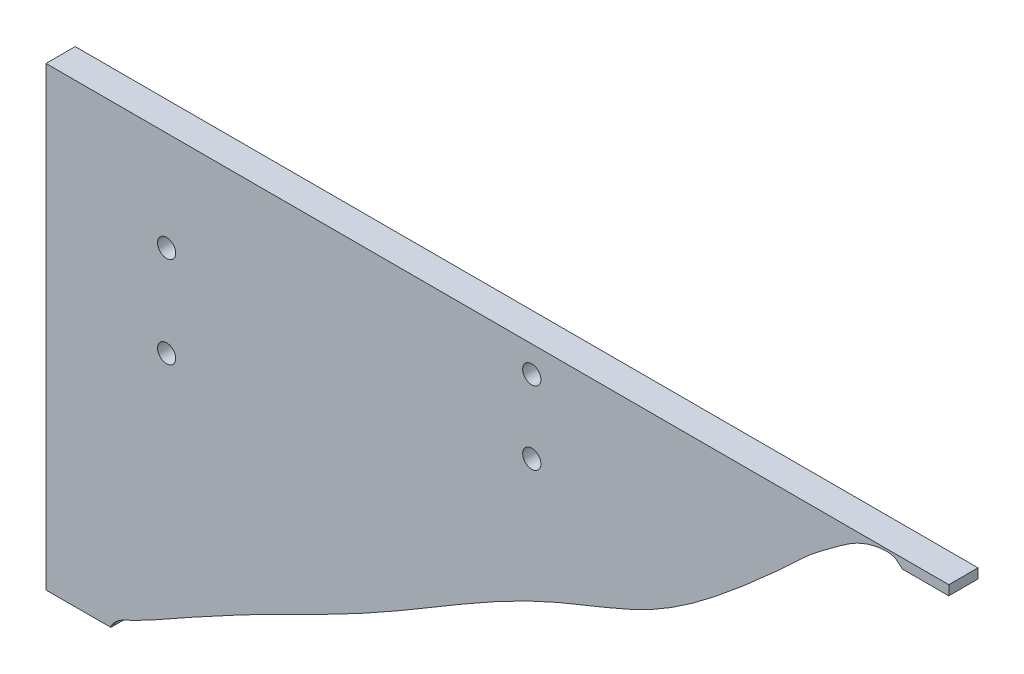
ISO-10303-21;
HEADER;
FILE_DESCRIPTION(('STEP AP214'),'2;1');
FILE_NAME('part.step','',(''),(''),'','','');
FILE_SCHEMA(('AUTOMOTIVE_DESIGN { 1 0 10303 214 1 1 1 1 }'));
ENDSEC;
DATA;
#1=APPLICATION_CONTEXT('core data for automotive mechanical design processes');
#2=APPLICATION_PROTOCOL_DEFINITION('international standard','automotive_design',2000,#1);
#3=PRODUCT_CONTEXT('',#1,'mechanical');
#4=PRODUCT('Part','Part','',(#3));
#5=PRODUCT_RELATED_PRODUCT_CATEGORY('part','',(#4));
#6=PRODUCT_DEFINITION_FORMATION('','',#4);
#7=PRODUCT_DEFINITION_CONTEXT('part definition',#1,'design');
#8=PRODUCT_DEFINITION('design','',#6,#7);
#9=PRODUCT_DEFINITION_SHAPE('','',#8);
#10=(LENGTH_UNIT() NAMED_UNIT(*) SI_UNIT(.MILLI.,.METRE.));
#11=(NAMED_UNIT(*) PLANE_ANGLE_UNIT() SI_UNIT($,.RADIAN.));
#12=(NAMED_UNIT(*) SI_UNIT($,.STERADIAN.) SOLID_ANGLE_UNIT());
#13=UNCERTAINTY_MEASURE_WITH_UNIT(LENGTH_MEASURE(1.E-05),#10,'distance_accuracy_value','');
#14=(GEOMETRIC_REPRESENTATION_CONTEXT(3) GLOBAL_UNCERTAINTY_ASSIGNED_CONTEXT((#13)) GLOBAL_UNIT_ASSIGNED_CONTEXT((#10,
#11,#12)) REPRESENTATION_CONTEXT('',''));
#15=CARTESIAN_POINT('',(0.,0.,0.));
#16=DIRECTION('',(0.,0.,1.));
#17=DIRECTION('',(1.,0.,0.));
#18=AXIS2_PLACEMENT_3D('',#15,#16,#17);
#19=CARTESIAN_POINT('',(-124.169636204117,-122.711595078371,99.9999999999997));
#20=DIRECTION('',(0.,0.,-1.));
#21=DIRECTION('',(-1.,0.,0.));
#22=AXIS2_PLACEMENT_3D('',#19,#20,#21);
#23=PLANE('',#22);
#24=CARTESIAN_POINT('',(-100.,-50.,99.9999999999997));
#25=DIRECTION('',(0.,0.,-1.));
#26=DIRECTION('',(-1.,0.,0.));
#27=AXIS2_PLACEMENT_3D('',#24,#25,#26);
#28=CIRCLE('',#27,2.5);
#29=CARTESIAN_POINT('',(-102.5,-50.,99.9999999999997));
#30=VERTEX_POINT('',#29);
#31=EDGE_CURVE('E199',#30,#30,#28,.F.);
#32=ORIENTED_EDGE('',*,*,#31,.F.);
#33=EDGE_LOOP('',(#32));
#34=FACE_BOUND('',#33,.T.);
#35=CARTESIAN_POINT('',(0.0705666698621599,-4.96037406111782,99.9999999999997));
#36=DIRECTION('',(0.,0.,-1.));
#37=DIRECTION('',(-1.,0.,0.));
#38=AXIS2_PLACEMENT_3D('',#35,#36,#37);
#39=CIRCLE('',#38,2.5);
#40=CARTESIAN_POINT('',(-2.42943333013784,-4.96037406111782,99.9999999999997));
#41=VERTEX_POINT('',#40);
#42=EDGE_CURVE('E187',#41,#41,#39,.F.);
#43=ORIENTED_EDGE('',*,*,#42,.F.);
#44=EDGE_LOOP('',(#43));
#45=FACE_BOUND('',#44,.T.);
#46=CARTESIAN_POINT('',(-115.279814759587,-122.698196579646,99.9999999999997));
#47=CARTESIAN_POINT('',(-121.20636212454,-122.707302344875,99.9999999999997));
#48=CARTESIAN_POINT('',(-127.132910077342,-122.716026331975,99.9999999999997));
#49=CARTESIAN_POINT('',(-133.059458267704,-122.724578016771,99.9999999999997));
#50=B_SPLINE_CURVE_WITH_KNOTS('',3,(#46,#47,#48,#49),.UNSPECIFIED.,.F.,.F.,(4,4),(0.,1.),.UNSPECIFIED.);
#51=CARTESIAN_POINT('',(-133.059458267704,-122.724578016771,99.9999999999997));
#52=VERTEX_POINT('',#51);
#53=CARTESIAN_POINT('',(-115.279814759587,-122.698196579646,99.9999999999997));
#54=VERTEX_POINT('',#53);
#55=EDGE_CURVE('E242',#52,#54,#50,.F.);
#56=ORIENTED_EDGE('',*,*,#55,.T.);
#57=CARTESIAN_POINT('',(101.542697698655,-0.397367776712153,99.9999999999997));
#58=CARTESIAN_POINT('',(101.469163101263,-0.247017982916062,99.9999999999997));
#59=CARTESIAN_POINT('',(101.356910621738,-0.124020229300448,99.9999999999997));
#60=CARTESIAN_POINT('',(101.109220352085,0.0978628181401973,99.9999999999997));
#61=CARTESIAN_POINT('',(100.977881083221,0.199766638114996,99.9999999999997));
#62=CARTESIAN_POINT('',(100.718358444522,0.407380198846738,99.9999999999997));
#63=CARTESIAN_POINT('',(100.590791378732,0.5140176030452,99.9999999999997));
#64=CARTESIAN_POINT('',(100.331252477116,0.720990659515745,99.9999999999997));
#65=CARTESIAN_POINT('',(100.199295601272,0.82112105301081,99.9999999999997));
#66=CARTESIAN_POINT('',(99.9282615121084,1.01045720873266,99.9999999999997));
#67=CARTESIAN_POINT('',(99.7891548310066,1.09961775896339,99.9999999999997));
#68=CARTESIAN_POINT('',(99.4961529886652,1.25524910727041,99.9999999999997));
#69=CARTESIAN_POINT('',(99.3412082182809,1.32251509346093,99.9999999999997));
#70=CARTESIAN_POINT('',(98.8702388773052,1.48720168883613,99.9999999999997));
#71=CARTESIAN_POINT('',(98.5459693345183,1.55130716658925,99.9999999999997));
#72=CARTESIAN_POINT('',(97.8863590845331,1.63036423385321,99.9999999999997));
#73=CARTESIAN_POINT('',(97.5528034752308,1.64511922098397,99.9999999999997));
#74=CARTESIAN_POINT('',(96.891170940384,1.64749112226704,99.9999999999997));
#75=CARTESIAN_POINT('',(96.5612171783758,1.6322043359926,99.9999999999997));
#76=CARTESIAN_POINT('',(95.5733868144175,1.54755599472912,99.9999999999997));
#77=CARTESIAN_POINT('',(94.9153123779226,1.4450567700185,99.9999999999997));
#78=CARTESIAN_POINT('',(93.616722452856,1.1797323774055,99.9999999999997));
#79=CARTESIAN_POINT('',(92.9751727490288,1.01437558630133,99.9999999999997));
#80=CARTESIAN_POINT('',(91.7066276289974,0.622224865003363,99.9999999999997));
#81=CARTESIAN_POINT('',(91.0864370534127,0.396457422235448,99.9999999999997));
#82=CARTESIAN_POINT('',(89.2765755309225,-0.369913249696398,99.9999999999997));
#83=CARTESIAN_POINT('',(88.1378362029038,-1.00679362295404,99.9999999999997));
#84=CARTESIAN_POINT('',(85.9306948164455,-2.41116752617038,99.9999999999997));
#85=CARTESIAN_POINT('',(84.8607996750002,-3.17763339066288,99.9999999999997));
#86=CARTESIAN_POINT('',(82.7348828085725,-4.72485917787858,99.9999999999997));
#87=CARTESIAN_POINT('',(81.6766557694189,-5.50485203568875,99.9999999999997));
#88=CARTESIAN_POINT('',(79.5670549194846,-7.07407886526673,99.9999999999997));
#89=CARTESIAN_POINT('',(78.5147692119556,-7.8634836119559,99.9999999999997));
#90=CARTESIAN_POINT('',(76.9732571366074,-9.09224101027398,99.9999999999997));
#91=CARTESIAN_POINT('',(76.4662794594427,-9.50971502516881,99.9999999999997));
#92=CARTESIAN_POINT('',(75.4718021148715,-10.3670615792103,99.9999999999997));
#93=CARTESIAN_POINT('',(74.9853438012207,-10.8081316117172,99.9999999999997));
#94=CARTESIAN_POINT('',(73.5461137023219,-12.1545070499932,99.9999999999997));
#95=CARTESIAN_POINT('',(72.609063716763,-13.0775021698299,99.9999999999997));
#96=CARTESIAN_POINT('',(70.6992248441633,-14.8839826795536,99.9999999999997));
#97=CARTESIAN_POINT('',(69.7306505425582,-15.7724493099651,99.9999999999997));
#98=CARTESIAN_POINT('',(66.8182305427634,-18.4306034053667,99.9999999999997));
#99=CARTESIAN_POINT('',(64.873127244851,-20.1996797886697,99.9999999999997));
#100=CARTESIAN_POINT('',(60.9392904269927,-23.6863594082087,99.9999999999997));
#101=CARTESIAN_POINT('',(58.95505223961,-25.4088617700271,99.9999999999997));
#102=CARTESIAN_POINT('',(54.9464865685715,-28.8056350092525,99.9999999999997));
#103=CARTESIAN_POINT('',(52.921196036184,-30.4787472414797,99.9999999999997));
#104=CARTESIAN_POINT('',(49.8395566560479,-32.9358357540928,99.9999999999997));
#105=CARTESIAN_POINT('',(48.8050140745123,-33.7460471816799,99.9999999999997));
#106=CARTESIAN_POINT('',(46.7175744939729,-35.3443878133609,99.9999999999997));
#107=CARTESIAN_POINT('',(45.6640343770027,-36.1330314593292,99.9999999999997));
#108=CARTESIAN_POINT('',(42.4762593951903,-38.4497740668082,99.9999999999997));
#109=CARTESIAN_POINT('',(40.3111603475952,-39.9263527334092,99.9999999999997));
#110=CARTESIAN_POINT('',(35.8750757023161,-42.699344641193,99.9999999999997));
#111=CARTESIAN_POINT('',(33.60419854689,-43.9959423963251,99.9999999999997));
#112=CARTESIAN_POINT('',(28.9519359825613,-46.4011086764074,99.9999999999997));
#113=CARTESIAN_POINT('',(26.5684829138391,-47.5088948911576,99.9999999999997));
#114=CARTESIAN_POINT('',(21.7333591199305,-49.5960295317488,99.9999999999997));
#115=CARTESIAN_POINT('',(19.2865018136151,-50.5776811936054,99.9999999999997));
#116=CARTESIAN_POINT('',(14.3908235515313,-52.5368343568848,99.9999999999997));
#117=CARTESIAN_POINT('',(11.9433640304218,-53.5172132416643,99.9999999999997));
#118=CARTESIAN_POINT('',(7.08790476479483,-55.5613689941441,99.9999999999997));
#119=CARTESIAN_POINT('',(4.67809959509903,-56.6213301073929,99.9999999999997));
#120=CARTESIAN_POINT('',(-0.0965285224121329,-58.8363219692535,99.9999999999997));
#121=CARTESIAN_POINT('',(-2.46129900475342,-59.9914636033058,99.9999999999997));
#122=CARTESIAN_POINT('',(-9.49146657304679,-63.5924561787963,99.9999999999997));
#123=CARTESIAN_POINT('',(-14.0919197547703,-66.1755656422899,99.9999999999997));
#124=CARTESIAN_POINT('',(-23.2195724367066,-71.4966057519373,99.9999999999997));
#125=CARTESIAN_POINT('',(-27.7431038250143,-74.2294197305133,99.9999999999997));
#126=CARTESIAN_POINT('',(-34.572179055983,-78.2501654493482,99.9999999999997));
#127=CARTESIAN_POINT('',(-36.8554596744361,-79.5780291940622,99.9999999999997));
#128=CARTESIAN_POINT('',(-41.4450431141751,-82.1925666438068,99.9999999999997));
#129=CARTESIAN_POINT('',(-43.7513198510047,-83.4792870176897,99.9999999999997));
#130=CARTESIAN_POINT('',(-48.3904483211985,-86.0051812656787,99.9999999999997));
#131=CARTESIAN_POINT('',(-50.7233625200051,-87.2442433801036,99.9999999999997));
#132=CARTESIAN_POINT('',(-55.4122837618093,-89.6810511816959,99.9999999999997));
#133=CARTESIAN_POINT('',(-57.7682148593682,-90.8789327462016,99.9999999999997));
#134=CARTESIAN_POINT('',(-64.8549893689721,-94.4386173063572,99.9999999999997));
#135=CARTESIAN_POINT('',(-69.6038182612594,-96.7647635991863,99.9999999999997));
#136=CARTESIAN_POINT('',(-76.6736958073153,-100.358448500288,99.9999999999997));
#137=CARTESIAN_POINT('',(-79.0206958642394,-101.575304609632,99.9999999999997));
#138=CARTESIAN_POINT('',(-83.6954070264147,-104.04701272172,99.9999999999997));
#139=CARTESIAN_POINT('',(-86.0228714559613,-105.301873779108,99.9999999999997));
#140=CARTESIAN_POINT('',(-90.6617821663452,-107.840573225944,99.9999999999997));
#141=CARTESIAN_POINT('',(-92.9731363885707,-109.124653395561,99.9999999999997));
#142=CARTESIAN_POINT('',(-97.5855102123072,-111.711240730659,99.9999999999997));
#143=CARTESIAN_POINT('',(-99.887259151756,-113.012532040517,99.9999999999997));
#144=CARTESIAN_POINT('',(-103.35075278274,-114.944806566213,99.9999999999997));
#145=CARTESIAN_POINT('',(-104.508091280219,-115.583728505795,99.9999999999997));
#146=CARTESIAN_POINT('',(-106.255203321876,-116.521903005916,99.9999999999997));
#147=CARTESIAN_POINT('',(-106.840006588682,-116.83033456351,99.9999999999997));
#148=CARTESIAN_POINT('',(-108.019812902304,-117.425747991996,99.9999999999997));
#149=CARTESIAN_POINT('',(-108.616092510667,-117.710312759139,99.9999999999997));
#150=CARTESIAN_POINT('',(-109.816332924029,-118.263611250251,99.9999999999997));
#151=CARTESIAN_POINT('',(-110.418941195341,-118.53513256321,99.9999999999997));
#152=CARTESIAN_POINT('',(-111.609417817147,-119.108554351904,99.9999999999997));
#153=CARTESIAN_POINT('',(-112.200342695589,-119.4079889853,99.9999999999997));
#154=CARTESIAN_POINT('',(-113.033825206942,-119.933392077269,99.9999999999997));
#155=CARTESIAN_POINT('',(-113.302784066984,-120.121697186575,99.9999999999997));
#156=CARTESIAN_POINT('',(-113.81259897991,-120.540042638498,99.9999999999997));
#157=CARTESIAN_POINT('',(-114.05255140627,-120.773942906916,99.9999999999997));
#158=CARTESIAN_POINT('',(-114.493658050267,-121.267375781495,99.9999999999997));
#159=CARTESIAN_POINT('',(-114.697201814406,-121.527734971403,99.9999999999997));
#160=CARTESIAN_POINT('',(-114.982282663062,-121.934503357269,99.9999999999997));
#161=CARTESIAN_POINT('',(-115.07574363731,-122.073198309418,99.9999999999997));
#162=CARTESIAN_POINT('',(-115.190638448759,-122.294748056244,99.9999999999997));
#163=CARTESIAN_POINT('',(-115.224073697014,-122.37073105293,99.9999999999997));
#164=CARTESIAN_POINT('',(-115.271165245422,-122.531372741772,99.9999999999997));
#165=CARTESIAN_POINT('',(-115.283962983492,-122.614408645909,99.9999999999997));
#166=CARTESIAN_POINT('',(-115.279814759587,-122.698196579646,99.9999999999997));
#167=B_SPLINE_CURVE_WITH_KNOTS('',3,(#57,#58,#59,#60,#61,#62,#63,#64,#65,#66,#67,#68,#69,#70,
#71,#72,#73,#74,#75,#76,#77,#78,#79,#80,#81,#82,#83,#84,#85,#86,#87,#88,#89,#90,#91,#92,#93,#94,
#95,#96,#97,#98,#99,#100,#101,#102,#103,#104,#105,#106,#107,#108,#109,#110,#111,#112,#113,#114,
#115,#116,#117,#118,#119,#120,#121,#122,#123,#124,#125,#126,#127,#128,#129,#130,#131,#132,#133,
#134,#135,#136,#137,#138,#139,#140,#141,#142,#143,#144,#145,#146,#147,#148,#149,#150,#151,#152,
#153,#154,#155,#156,#157,#158,#159,#160,#161,#162,#163,#164,#165,#166),.UNSPECIFIED.,.F.,.F.,(4,
2,2,2,2,2,2,2,2,2,2,2,2,2,2,2,2,2,2,2,2,2,2,2,2,2,2,2,2,2,2,2,2,2,2,2,2,2,2,2,2,2,2,2,2,2,2,2,2,
2,2,2,2,2,4),(0.,0.001953125,0.00390624999999989,0.00585937499999989,0.00781249999999978,
0.00976562499999978,0.0117187499999997,0.0156249999999997,0.0195312499999997,0.0234374999999997,
0.0312499999999998,0.0390624999999998,0.0468749999999998,0.0624999999999998,0.0781249999999998,
0.0937499999999999,0.109375,0.1171875,0.125,0.140625,0.15625,0.1875,0.21875,0.25,0.265625,
0.281249999999999,0.312499999999999,0.343749999999999,0.374999999999999,0.406249999999999,
0.437499999999999,0.468749999999999,0.499999999999999,0.562499999999999,0.624999999999999,
0.656249999999999,0.687499999999999,0.718749999999999,0.749999999999999,0.812499999999999,
0.843749999999999,0.874999999999999,0.906249999999999,0.9375,0.953125,0.9609375,0.96875,
0.9765625,0.984375,0.98828125,0.9921875,0.99609375,0.998046875,0.9990234375,1.),.UNSPECIFIED.);
#168=CARTESIAN_POINT('',(101.542697698657,-0.39736777671264,99.9999999999997));
#169=VERTEX_POINT('',#168);
#170=EDGE_CURVE('E88',#54,#169,#167,.F.);
#171=ORIENTED_EDGE('',*,*,#170,.T.);
#172=CARTESIAN_POINT('',(114.343833873077,-0.399076207822359,99.9999999999997));
#173=CARTESIAN_POINT('',(110.076788479651,-0.398521557738626,99.9999999999997));
#174=CARTESIAN_POINT('',(105.8097430879,-0.397953729320266,99.9999999999997));
#175=CARTESIAN_POINT('',(101.542697698657,-0.39736777671264,99.9999999999997));
#176=B_SPLINE_CURVE_WITH_KNOTS('',3,(#172,#173,#174,#175),.UNSPECIFIED.,.F.,.F.,(4,4),(0.,1.),.UNSPECIFIED.);
#177=CARTESIAN_POINT('',(114.343833873077,-0.399076207822358,99.9999999999997));
#178=VERTEX_POINT('',#177);
#179=EDGE_CURVE('E102',#169,#178,#176,.F.);
#180=ORIENTED_EDGE('',*,*,#179,.T.);
#181=DIRECTION('',(0.,1.,0.));
#182=VECTOR('',#181,1.);
#183=CARTESIAN_POINT('',(114.343833873077,2.25600000000004,99.9999999999997));
#184=LINE('',#183,#182);
#185=CARTESIAN_POINT('',(114.343833873077,2.25600000000004,99.9999999999997));
#186=VERTEX_POINT('',#185);
#187=EDGE_CURVE('E96',#178,#186,#184,.T.);
#188=ORIENTED_EDGE('',*,*,#187,.T.);
#189=DIRECTION('',(-1.,0.,0.));
#190=VECTOR('',#189,1.);
#191=CARTESIAN_POINT('',(114.343833873077,2.25600000000004,99.9999999999997));
#192=LINE('',#191,#190);
#193=CARTESIAN_POINT('',(-133.059458267704,2.25600000000001,99.9999999999997));
#194=VERTEX_POINT('',#193);
#195=EDGE_CURVE('E100',#186,#194,#192,.T.);
#196=ORIENTED_EDGE('',*,*,#195,.T.);
#197=DIRECTION('',(0.,-1.,0.));
#198=VECTOR('',#197,1.);
#199=CARTESIAN_POINT('',(-133.059458267704,-122.724578016771,99.9999999999997));
#200=LINE('',#199,#198);
#201=EDGE_CURVE('E51',#194,#52,#200,.T.);
#202=ORIENTED_EDGE('',*,*,#201,.T.);
#203=EDGE_LOOP('',(#56,#171,#180,#188,#196,#202));
#204=FACE_BOUND('',#203,.T.);
#205=CARTESIAN_POINT('',(0.0705666698621599,-25.,99.9999999999997));
#206=DIRECTION('',(0.,0.,-1.));
#207=DIRECTION('',(-1.,0.,0.));
#208=AXIS2_PLACEMENT_3D('',#205,#206,#207);
#209=CIRCLE('',#208,2.5);
#210=CARTESIAN_POINT('',(-2.42943333013784,-25.,99.9999999999997));
#211=VERTEX_POINT('',#210);
#212=EDGE_CURVE('E195',#211,#211,#209,.F.);
#213=ORIENTED_EDGE('',*,*,#212,.F.);
#214=EDGE_LOOP('',(#213));
#215=FACE_BOUND('',#214,.T.);
#216=CARTESIAN_POINT('',(-100.,-25.,99.9999999999997));
#217=DIRECTION('',(0.,0.,-1.));
#218=DIRECTION('',(-1.,0.,0.));
#219=AXIS2_PLACEMENT_3D('',#216,#217,#218);
#220=CIRCLE('',#219,2.5);
#221=CARTESIAN_POINT('',(-102.5,-25.,99.9999999999997));
#222=VERTEX_POINT('',#221);
#223=EDGE_CURVE('E203',#222,#222,#220,.F.);
#224=ORIENTED_EDGE('',*,*,#223,.F.);
#225=EDGE_LOOP('',(#224));
#226=FACE_BOUND('',#225,.T.);
#227=ADVANCED_FACE('F30',(#34,#45,#204,#215,#226),#23,.F.);
#228=CARTESIAN_POINT('',(-124.169636204117,-122.711595078371,91.9999999999997));
#229=DIRECTION('',(0.,0.,-1.));
#230=DIRECTION('',(-1.,0.,0.));
#231=AXIS2_PLACEMENT_3D('',#228,#229,#230);
#232=PLANE('',#231);
#233=CARTESIAN_POINT('',(-100.,-50.,91.9999999999997));
#234=DIRECTION('',(0.,0.,-1.));
#235=DIRECTION('',(-1.,0.,0.));
#236=AXIS2_PLACEMENT_3D('',#233,#234,#235);
#237=CIRCLE('',#236,2.5);
#238=CARTESIAN_POINT('',(-102.5,-50.,91.9999999999997));
#239=VERTEX_POINT('',#238);
#240=EDGE_CURVE('E202',#239,#239,#237,.F.);
#241=ORIENTED_EDGE('',*,*,#240,.T.);
#242=EDGE_LOOP('',(#241));
#243=FACE_BOUND('',#242,.T.);
#244=CARTESIAN_POINT('',(0.0705666698621599,-4.96037406111782,91.9999999999997));
#245=DIRECTION('',(0.,0.,-1.));
#246=DIRECTION('',(-1.,0.,0.));
#247=AXIS2_PLACEMENT_3D('',#244,#245,#246);
#248=CIRCLE('',#247,2.5);
#249=CARTESIAN_POINT('',(-2.42943333013784,-4.96037406111782,91.9999999999997));
#250=VERTEX_POINT('',#249);
#251=EDGE_CURVE('E194',#250,#250,#248,.F.);
#252=ORIENTED_EDGE('',*,*,#251,.T.);
#253=EDGE_LOOP('',(#252));
#254=FACE_BOUND('',#253,.T.);
#255=CARTESIAN_POINT('',(-133.059458267704,-122.724578016771,91.9999999999997));
#256=CARTESIAN_POINT('',(-127.132910077342,-122.716026331975,91.9999999999997));
#257=CARTESIAN_POINT('',(-121.20636212454,-122.707302344875,91.9999999999997));
#258=CARTESIAN_POINT('',(-115.279814759587,-122.698196579646,91.9999999999997));
#259=B_SPLINE_CURVE_WITH_KNOTS('',3,(#255,#256,#257,#258),.UNSPECIFIED.,.F.,.F.,(4,4),(0.,1.),.UNSPECIFIED.);
#260=CARTESIAN_POINT('',(-133.059458267704,-122.724578016771,91.9999999999997));
#261=VERTEX_POINT('',#260);
#262=CARTESIAN_POINT('',(-115.279814759587,-122.698196579646,91.9999999999997));
#263=VERTEX_POINT('',#262);
#264=EDGE_CURVE('E193',#261,#263,#259,.T.);
#265=ORIENTED_EDGE('',*,*,#264,.F.);
#266=DIRECTION('',(0.,-1.,0.));
#267=VECTOR('',#266,1.);
#268=CARTESIAN_POINT('',(-133.059458267704,-122.724578016771,91.9999999999997));
#269=LINE('',#268,#267);
#270=CARTESIAN_POINT('',(-133.059458267704,2.25600000000001,91.9999999999997));
#271=VERTEX_POINT('',#270);
#272=EDGE_CURVE('E80',#271,#261,#269,.T.);
#273=ORIENTED_EDGE('',*,*,#272,.F.);
#274=DIRECTION('',(-1.,0.,0.));
#275=VECTOR('',#274,1.);
#276=CARTESIAN_POINT('',(114.343833873077,2.25600000000004,91.9999999999997));
#277=LINE('',#276,#275);
#278=CARTESIAN_POINT('',(114.343833873077,2.25600000000004,91.9999999999997));
#279=VERTEX_POINT('',#278);
#280=EDGE_CURVE('E74',#279,#271,#277,.T.);
#281=ORIENTED_EDGE('',*,*,#280,.F.);
#282=DIRECTION('',(0.,1.,0.));
#283=VECTOR('',#282,1.);
#284=CARTESIAN_POINT('',(114.343833873077,2.25600000000004,91.9999999999997));
#285=LINE('',#284,#283);
#286=CARTESIAN_POINT('',(114.343833873077,-0.399076207822358,91.9999999999997));
#287=VERTEX_POINT('',#286);
#288=EDGE_CURVE('E111',#287,#279,#285,.T.);
#289=ORIENTED_EDGE('',*,*,#288,.F.);
#290=CARTESIAN_POINT('',(101.542697698657,-0.39736777671264,91.9999999999997));
#291=CARTESIAN_POINT('',(105.8097430879,-0.397953729320266,91.9999999999997));
#292=CARTESIAN_POINT('',(110.076788479651,-0.398521557738626,91.9999999999997));
#293=CARTESIAN_POINT('',(114.343833873077,-0.399076207822359,91.9999999999997));
#294=B_SPLINE_CURVE_WITH_KNOTS('',3,(#290,#291,#292,#293),.UNSPECIFIED.,.F.,.F.,(4,4),(0.,1.),.UNSPECIFIED.);
#295=CARTESIAN_POINT('',(101.542697698657,-0.39736777671264,91.9999999999997));
#296=VERTEX_POINT('',#295);
#297=EDGE_CURVE('E310',#296,#287,#294,.T.);
#298=ORIENTED_EDGE('',*,*,#297,.F.);
#299=CARTESIAN_POINT('',(-115.279814759587,-122.698196579646,91.9999999999997));
#300=CARTESIAN_POINT('',(-115.283962983492,-122.614408645909,91.9999999999997));
#301=CARTESIAN_POINT('',(-115.271165245422,-122.531372741772,91.9999999999997));
#302=CARTESIAN_POINT('',(-115.224073697014,-122.37073105293,91.9999999999997));
#303=CARTESIAN_POINT('',(-115.190638448759,-122.294748056244,91.9999999999997));
#304=CARTESIAN_POINT('',(-115.07574363731,-122.073198309418,91.9999999999997));
#305=CARTESIAN_POINT('',(-114.982282663062,-121.934503357269,91.9999999999997));
#306=CARTESIAN_POINT('',(-114.697201814406,-121.527734971403,91.9999999999997));
#307=CARTESIAN_POINT('',(-114.493658050267,-121.267375781495,91.9999999999997));
#308=CARTESIAN_POINT('',(-114.05255140627,-120.773942906916,91.9999999999997));
#309=CARTESIAN_POINT('',(-113.81259897991,-120.540042638498,91.9999999999997));
#310=CARTESIAN_POINT('',(-113.302784066984,-120.121697186575,91.9999999999997));
#311=CARTESIAN_POINT('',(-113.033825206942,-119.933392077269,91.9999999999997));
#312=CARTESIAN_POINT('',(-112.200342695589,-119.4079889853,91.9999999999997));
#313=CARTESIAN_POINT('',(-111.609417817147,-119.108554351904,91.9999999999997));
#314=CARTESIAN_POINT('',(-110.418941195341,-118.53513256321,91.9999999999997));
#315=CARTESIAN_POINT('',(-109.816332924029,-118.263611250251,91.9999999999997));
#316=CARTESIAN_POINT('',(-108.616092510667,-117.710312759139,91.9999999999997));
#317=CARTESIAN_POINT('',(-108.019812902304,-117.425747991996,91.9999999999997));
#318=CARTESIAN_POINT('',(-106.840006588682,-116.83033456351,91.9999999999997));
#319=CARTESIAN_POINT('',(-106.255203321876,-116.521903005916,91.9999999999997));
#320=CARTESIAN_POINT('',(-104.508091280219,-115.583728505795,91.9999999999997));
#321=CARTESIAN_POINT('',(-103.35075278274,-114.944806566213,91.9999999999997));
#322=CARTESIAN_POINT('',(-99.887259151756,-113.012532040517,91.9999999999997));
#323=CARTESIAN_POINT('',(-97.5855102123072,-111.711240730659,91.9999999999997));
#324=CARTESIAN_POINT('',(-92.9731363885707,-109.124653395561,91.9999999999997));
#325=CARTESIAN_POINT('',(-90.6617821663452,-107.840573225944,91.9999999999997));
#326=CARTESIAN_POINT('',(-86.0228714559613,-105.301873779108,91.9999999999997));
#327=CARTESIAN_POINT('',(-83.6954070264147,-104.04701272172,91.9999999999997));
#328=CARTESIAN_POINT('',(-79.0206958642394,-101.575304609632,91.9999999999997));
#329=CARTESIAN_POINT('',(-76.6736958073153,-100.358448500288,91.9999999999997));
#330=CARTESIAN_POINT('',(-69.6038182612594,-96.7647635991863,91.9999999999997));
#331=CARTESIAN_POINT('',(-64.8549893689721,-94.4386173063572,91.9999999999997));
#332=CARTESIAN_POINT('',(-57.7682148593682,-90.8789327462016,91.9999999999997));
#333=CARTESIAN_POINT('',(-55.4122837618093,-89.6810511816959,91.9999999999997));
#334=CARTESIAN_POINT('',(-50.7233625200051,-87.2442433801036,91.9999999999997));
#335=CARTESIAN_POINT('',(-48.3904483211985,-86.0051812656787,91.9999999999997));
#336=CARTESIAN_POINT('',(-43.7513198510047,-83.4792870176897,91.9999999999997));
#337=CARTESIAN_POINT('',(-41.4450431141751,-82.1925666438068,91.9999999999997));
#338=CARTESIAN_POINT('',(-36.8554596744361,-79.5780291940622,91.9999999999997));
#339=CARTESIAN_POINT('',(-34.572179055983,-78.2501654493482,91.9999999999997));
#340=CARTESIAN_POINT('',(-27.7431038250143,-74.2294197305133,91.9999999999997));
#341=CARTESIAN_POINT('',(-23.2195724367066,-71.4966057519373,91.9999999999997));
#342=CARTESIAN_POINT('',(-14.0919197547703,-66.1755656422899,91.9999999999997));
#343=CARTESIAN_POINT('',(-9.49146657304679,-63.5924561787963,91.9999999999997));
#344=CARTESIAN_POINT('',(-2.46129900475342,-59.9914636033058,91.9999999999997));
#345=CARTESIAN_POINT('',(-0.0965285224121329,-58.8363219692535,91.9999999999997));
#346=CARTESIAN_POINT('',(4.67809959509903,-56.6213301073929,91.9999999999997));
#347=CARTESIAN_POINT('',(7.08790476479483,-55.5613689941441,91.9999999999997));
#348=CARTESIAN_POINT('',(11.9433640304218,-53.5172132416643,91.9999999999997));
#349=CARTESIAN_POINT('',(14.3908235515313,-52.5368343568848,91.9999999999997));
#350=CARTESIAN_POINT('',(19.2865018136151,-50.5776811936054,91.9999999999997));
#351=CARTESIAN_POINT('',(21.7333591199305,-49.5960295317488,91.9999999999997));
#352=CARTESIAN_POINT('',(26.5684829138391,-47.5088948911576,91.9999999999997));
#353=CARTESIAN_POINT('',(28.9519359825613,-46.4011086764074,91.9999999999997));
#354=CARTESIAN_POINT('',(33.60419854689,-43.9959423963251,91.9999999999997));
#355=CARTESIAN_POINT('',(35.8750757023161,-42.699344641193,91.9999999999997));
#356=CARTESIAN_POINT('',(40.3111603475952,-39.9263527334092,91.9999999999997));
#357=CARTESIAN_POINT('',(42.4762593951903,-38.4497740668082,91.9999999999997));
#358=CARTESIAN_POINT('',(45.6640343770027,-36.1330314593292,91.9999999999997));
#359=CARTESIAN_POINT('',(46.7175744939729,-35.3443878133609,91.9999999999997));
#360=CARTESIAN_POINT('',(48.8050140745123,-33.7460471816799,91.9999999999997));
#361=CARTESIAN_POINT('',(49.8395566560479,-32.9358357540928,91.9999999999997));
#362=CARTESIAN_POINT('',(52.921196036184,-30.4787472414797,91.9999999999997));
#363=CARTESIAN_POINT('',(54.9464865685715,-28.8056350092525,91.9999999999997));
#364=CARTESIAN_POINT('',(58.95505223961,-25.4088617700271,91.9999999999997));
#365=CARTESIAN_POINT('',(60.9392904269927,-23.6863594082087,91.9999999999997));
#366=CARTESIAN_POINT('',(64.873127244851,-20.1996797886697,91.9999999999997));
#367=CARTESIAN_POINT('',(66.8182305427634,-18.4306034053667,91.9999999999997));
#368=CARTESIAN_POINT('',(69.7306505425582,-15.7724493099651,91.9999999999997));
#369=CARTESIAN_POINT('',(70.6992248441633,-14.8839826795536,91.9999999999997));
#370=CARTESIAN_POINT('',(72.609063716763,-13.0775021698299,91.9999999999997));
#371=CARTESIAN_POINT('',(73.5461137023219,-12.1545070499932,91.9999999999997));
#372=CARTESIAN_POINT('',(74.9853438012207,-10.8081316117172,91.9999999999997));
#373=CARTESIAN_POINT('',(75.4718021148715,-10.3670615792103,91.9999999999997));
#374=CARTESIAN_POINT('',(76.4662794594427,-9.50971502516881,91.9999999999997));
#375=CARTESIAN_POINT('',(76.9732571366074,-9.09224101027398,91.9999999999997));
#376=CARTESIAN_POINT('',(78.5147692119556,-7.8634836119559,91.9999999999997));
#377=CARTESIAN_POINT('',(79.5670549194846,-7.07407886526673,91.9999999999997));
#378=CARTESIAN_POINT('',(81.6766557694189,-5.50485203568875,91.9999999999997));
#379=CARTESIAN_POINT('',(82.7348828085725,-4.72485917787858,91.9999999999997));
#380=CARTESIAN_POINT('',(84.8607996750002,-3.17763339066288,91.9999999999997));
#381=CARTESIAN_POINT('',(85.9306948164455,-2.41116752617038,91.9999999999997));
#382=CARTESIAN_POINT('',(88.1378362029038,-1.00679362295404,91.9999999999997));
#383=CARTESIAN_POINT('',(89.2765755309225,-0.369913249696398,91.9999999999997));
#384=CARTESIAN_POINT('',(91.0864370534127,0.396457422235448,91.9999999999997));
#385=CARTESIAN_POINT('',(91.7066276289974,0.622224865003363,91.9999999999997));
#386=CARTESIAN_POINT('',(92.9751727490288,1.01437558630133,91.9999999999997));
#387=CARTESIAN_POINT('',(93.616722452856,1.1797323774055,91.9999999999997));
#388=CARTESIAN_POINT('',(94.9153123779226,1.4450567700185,91.9999999999997));
#389=CARTESIAN_POINT('',(95.5733868144175,1.54755599472912,91.9999999999997));
#390=CARTESIAN_POINT('',(96.5612171783758,1.6322043359926,91.9999999999997));
#391=CARTESIAN_POINT('',(96.891170940384,1.64749112226704,91.9999999999997));
#392=CARTESIAN_POINT('',(97.5528034752308,1.64511922098397,91.9999999999997));
#393=CARTESIAN_POINT('',(97.8863590845331,1.63036423385321,91.9999999999997));
#394=CARTESIAN_POINT('',(98.5459693345183,1.55130716658925,91.9999999999997));
#395=CARTESIAN_POINT('',(98.8702388773052,1.48720168883613,91.9999999999997));
#396=CARTESIAN_POINT('',(99.3412082182809,1.32251509346093,91.9999999999997));
#397=CARTESIAN_POINT('',(99.4961529886652,1.25524910727041,91.9999999999997));
#398=CARTESIAN_POINT('',(99.7891548310066,1.09961775896339,91.9999999999997));
#399=CARTESIAN_POINT('',(99.9282615121084,1.01045720873266,91.9999999999997));
#400=CARTESIAN_POINT('',(100.199295601272,0.82112105301081,91.9999999999997));
#401=CARTESIAN_POINT('',(100.331252477116,0.720990659515745,91.9999999999997));
#402=CARTESIAN_POINT('',(100.590791378732,0.5140176030452,91.9999999999997));
#403=CARTESIAN_POINT('',(100.718358444522,0.407380198846738,91.9999999999997));
#404=CARTESIAN_POINT('',(100.977881083221,0.199766638114996,91.9999999999997));
#405=CARTESIAN_POINT('',(101.109220352085,0.0978628181401973,91.9999999999997));
#406=CARTESIAN_POINT('',(101.356910621738,-0.124020229300448,91.9999999999997));
#407=CARTESIAN_POINT('',(101.469163101263,-0.247017982916062,91.9999999999997));
#408=CARTESIAN_POINT('',(101.542697698655,-0.397367776712153,91.9999999999997));
#409=B_SPLINE_CURVE_WITH_KNOTS('',3,(#299,#300,#301,#302,#303,#304,#305,#306,#307,#308,#309,
#310,#311,#312,#313,#314,#315,#316,#317,#318,#319,#320,#321,#322,#323,#324,#325,#326,#327,#328,
#329,#330,#331,#332,#333,#334,#335,#336,#337,#338,#339,#340,#341,#342,#343,#344,#345,#346,#347,
#348,#349,#350,#351,#352,#353,#354,#355,#356,#357,#358,#359,#360,#361,#362,#363,#364,#365,#366,
#367,#368,#369,#370,#371,#372,#373,#374,#375,#376,#377,#378,#379,#380,#381,#382,#383,#384,#385,
#386,#387,#388,#389,#390,#391,#392,#393,#394,#395,#396,#397,#398,#399,#400,#401,#402,#403,#404,
#405,#406,#407,#408),.UNSPECIFIED.,.F.,.F.,(4,2,2,2,2,2,2,2,2,2,2,2,2,2,2,2,2,2,2,2,2,2,2,2,2,2,
2,2,2,2,2,2,2,2,2,2,2,2,2,2,2,2,2,2,2,2,2,2,2,2,2,2,2,2,4),(0.,0.000976562500000029,
0.00195312500000006,0.00390625000000012,0.0078125000000001,0.0117187500000001,
0.0156250000000001,0.0234375000000001,0.0312500000000002,0.0390625000000002,0.0468750000000003,
0.0625000000000004,0.0937500000000005,0.125000000000001,0.156250000000001,0.187500000000001,
0.250000000000001,0.281250000000001,0.312500000000001,0.343750000000001,0.375000000000001,
0.437500000000001,0.500000000000001,0.531250000000001,0.562500000000001,0.593750000000001,
0.625000000000001,0.656250000000001,0.687500000000001,0.718750000000001,0.734375,0.75,0.78125,
0.8125,0.84375,0.859375,0.875,0.8828125,0.890625,0.90625,0.921875,0.9375,0.953125,0.9609375,
0.96875,0.9765625,0.98046875,0.984375,0.98828125,0.990234375,0.9921875,0.994140625,0.99609375,
0.998046875,1.),.UNSPECIFIED.);
#410=EDGE_CURVE('E299',#263,#296,#409,.T.);
#411=ORIENTED_EDGE('',*,*,#410,.F.);
#412=EDGE_LOOP('',(#265,#273,#281,#289,#298,#411));
#413=FACE_BOUND('',#412,.T.);
#414=CARTESIAN_POINT('',(0.0705666698621599,-25.,91.9999999999997));
#415=DIRECTION('',(0.,0.,-1.));
#416=DIRECTION('',(-1.,0.,0.));
#417=AXIS2_PLACEMENT_3D('',#414,#415,#416);
#418=CIRCLE('',#417,2.5);
#419=CARTESIAN_POINT('',(-2.42943333013784,-25.,91.9999999999997));
#420=VERTEX_POINT('',#419);
#421=EDGE_CURVE('E198',#420,#420,#418,.F.);
#422=ORIENTED_EDGE('',*,*,#421,.T.);
#423=EDGE_LOOP('',(#422));
#424=FACE_BOUND('',#423,.T.);
#425=CARTESIAN_POINT('',(-100.,-25.,91.9999999999997));
#426=DIRECTION('',(0.,0.,-1.));
#427=DIRECTION('',(-1.,0.,0.));
#428=AXIS2_PLACEMENT_3D('',#425,#426,#427);
#429=CIRCLE('',#428,2.5);
#430=CARTESIAN_POINT('',(-102.5,-25.,91.9999999999997));
#431=VERTEX_POINT('',#430);
#432=EDGE_CURVE('E36',#431,#431,#429,.F.);
#433=ORIENTED_EDGE('',*,*,#432,.T.);
#434=EDGE_LOOP('',(#433));
#435=FACE_BOUND('',#434,.T.);
#436=ADVANCED_FACE('F141',(#243,#254,#413,#424,#435),#232,.T.);
#437=CARTESIAN_POINT('',(-133.059458267704,-122.724578016771,99.9999999999997));
#438=CARTESIAN_POINT('',(-127.132910077342,-122.716026331975,99.9999999999997));
#439=CARTESIAN_POINT('',(-121.20636212454,-122.707302344875,99.9999999999997));
#440=CARTESIAN_POINT('',(-115.279814759587,-122.698196579646,99.9999999999997));
#441=B_SPLINE_CURVE_WITH_KNOTS('',3,(#437,#438,#439,#440),.UNSPECIFIED.,.F.,.F.,(4,4),(0.,1.),.UNSPECIFIED.);
#442=DIRECTION('',(0.,0.,-1.));
#443=VECTOR('',#442,1.);
#444=SURFACE_OF_LINEAR_EXTRUSION('',#441,#443);
#445=ORIENTED_EDGE('',*,*,#264,.T.);
#446=DIRECTION('',(0.,0.,-1.));
#447=VECTOR('',#446,1.);
#448=CARTESIAN_POINT('',(-115.279814759587,-122.698196579646,99.9999999999997));
#449=LINE('',#448,#447);
#450=EDGE_CURVE('E11',#54,#263,#449,.T.);
#451=ORIENTED_EDGE('',*,*,#450,.F.);
#452=ORIENTED_EDGE('',*,*,#55,.F.);
#453=DIRECTION('',(0.,0.,-1.));
#454=VECTOR('',#453,1.);
#455=CARTESIAN_POINT('',(-133.059458267704,-122.724578016771,99.9999999999997));
#456=LINE('',#455,#454);
#457=EDGE_CURVE('E117',#52,#261,#456,.T.);
#458=ORIENTED_EDGE('',*,*,#457,.T.);
#459=EDGE_LOOP('',(#445,#451,#452,#458));
#460=FACE_BOUND('',#459,.T.);
#461=ADVANCED_FACE('F32',(#460),#444,.F.);
#462=CARTESIAN_POINT('',(-115.279814759587,-122.698196579646,99.9999999999997));
#463=CARTESIAN_POINT('',(-115.283962983492,-122.614408645909,99.9999999999997));
#464=CARTESIAN_POINT('',(-115.271165245422,-122.531372741772,99.9999999999997));
#465=CARTESIAN_POINT('',(-115.224073697014,-122.37073105293,99.9999999999997));
#466=CARTESIAN_POINT('',(-115.190638448759,-122.294748056244,99.9999999999997));
#467=CARTESIAN_POINT('',(-115.07574363731,-122.073198309418,99.9999999999997));
#468=CARTESIAN_POINT('',(-114.982282663062,-121.934503357269,99.9999999999997));
#469=CARTESIAN_POINT('',(-114.697201814406,-121.527734971403,99.9999999999997));
#470=CARTESIAN_POINT('',(-114.493658050267,-121.267375781495,99.9999999999997));
#471=CARTESIAN_POINT('',(-114.05255140627,-120.773942906916,99.9999999999997));
#472=CARTESIAN_POINT('',(-113.81259897991,-120.540042638498,99.9999999999997));
#473=CARTESIAN_POINT('',(-113.302784066984,-120.121697186575,99.9999999999997));
#474=CARTESIAN_POINT('',(-113.033825206942,-119.933392077269,99.9999999999997));
#475=CARTESIAN_POINT('',(-112.200342695589,-119.4079889853,99.9999999999997));
#476=CARTESIAN_POINT('',(-111.609417817147,-119.108554351904,99.9999999999997));
#477=CARTESIAN_POINT('',(-110.418941195341,-118.53513256321,99.9999999999997));
#478=CARTESIAN_POINT('',(-109.816332924029,-118.263611250251,99.9999999999997));
#479=CARTESIAN_POINT('',(-108.616092510667,-117.710312759139,99.9999999999997));
#480=CARTESIAN_POINT('',(-108.019812902304,-117.425747991996,99.9999999999997));
#481=CARTESIAN_POINT('',(-106.840006588682,-116.83033456351,99.9999999999997));
#482=CARTESIAN_POINT('',(-106.255203321876,-116.521903005916,99.9999999999997));
#483=CARTESIAN_POINT('',(-104.508091280219,-115.583728505795,99.9999999999997));
#484=CARTESIAN_POINT('',(-103.35075278274,-114.944806566213,99.9999999999997));
#485=CARTESIAN_POINT('',(-99.887259151756,-113.012532040517,99.9999999999997));
#486=CARTESIAN_POINT('',(-97.5855102123072,-111.711240730659,99.9999999999997));
#487=CARTESIAN_POINT('',(-92.9731363885707,-109.124653395561,99.9999999999997));
#488=CARTESIAN_POINT('',(-90.6617821663452,-107.840573225944,99.9999999999997));
#489=CARTESIAN_POINT('',(-86.0228714559613,-105.301873779108,99.9999999999997));
#490=CARTESIAN_POINT('',(-83.6954070264147,-104.04701272172,99.9999999999997));
#491=CARTESIAN_POINT('',(-79.0206958642394,-101.575304609632,99.9999999999997));
#492=CARTESIAN_POINT('',(-76.6736958073153,-100.358448500288,99.9999999999997));
#493=CARTESIAN_POINT('',(-69.6038182612594,-96.7647635991863,99.9999999999997));
#494=CARTESIAN_POINT('',(-64.8549893689721,-94.4386173063572,99.9999999999997));
#495=CARTESIAN_POINT('',(-57.7682148593682,-90.8789327462016,99.9999999999997));
#496=CARTESIAN_POINT('',(-55.4122837618093,-89.6810511816959,99.9999999999997));
#497=CARTESIAN_POINT('',(-50.7233625200051,-87.2442433801036,99.9999999999997));
#498=CARTESIAN_POINT('',(-48.3904483211985,-86.0051812656787,99.9999999999997));
#499=CARTESIAN_POINT('',(-43.7513198510047,-83.4792870176897,99.9999999999997));
#500=CARTESIAN_POINT('',(-41.4450431141751,-82.1925666438068,99.9999999999997));
#501=CARTESIAN_POINT('',(-36.8554596744361,-79.5780291940622,99.9999999999997));
#502=CARTESIAN_POINT('',(-34.572179055983,-78.2501654493482,99.9999999999997));
#503=CARTESIAN_POINT('',(-27.7431038250143,-74.2294197305133,99.9999999999997));
#504=CARTESIAN_POINT('',(-23.2195724367066,-71.4966057519373,99.9999999999997));
#505=CARTESIAN_POINT('',(-14.0919197547703,-66.1755656422899,99.9999999999997));
#506=CARTESIAN_POINT('',(-9.49146657304679,-63.5924561787963,99.9999999999997));
#507=CARTESIAN_POINT('',(-2.46129900475342,-59.9914636033058,99.9999999999997));
#508=CARTESIAN_POINT('',(-0.0965285224121329,-58.8363219692535,99.9999999999997));
#509=CARTESIAN_POINT('',(4.67809959509903,-56.6213301073929,99.9999999999997));
#510=CARTESIAN_POINT('',(7.08790476479483,-55.5613689941441,99.9999999999997));
#511=CARTESIAN_POINT('',(11.9433640304218,-53.5172132416643,99.9999999999997));
#512=CARTESIAN_POINT('',(14.3908235515313,-52.5368343568848,99.9999999999997));
#513=CARTESIAN_POINT('',(19.2865018136151,-50.5776811936054,99.9999999999997));
#514=CARTESIAN_POINT('',(21.7333591199305,-49.5960295317488,99.9999999999997));
#515=CARTESIAN_POINT('',(26.5684829138391,-47.5088948911576,99.9999999999997));
#516=CARTESIAN_POINT('',(28.9519359825613,-46.4011086764074,99.9999999999997));
#517=CARTESIAN_POINT('',(33.60419854689,-43.9959423963251,99.9999999999997));
#518=CARTESIAN_POINT('',(35.8750757023161,-42.699344641193,99.9999999999997));
#519=CARTESIAN_POINT('',(40.3111603475952,-39.9263527334092,99.9999999999997));
#520=CARTESIAN_POINT('',(42.4762593951903,-38.4497740668082,99.9999999999997));
#521=CARTESIAN_POINT('',(45.6640343770027,-36.1330314593292,99.9999999999997));
#522=CARTESIAN_POINT('',(46.7175744939729,-35.3443878133609,99.9999999999997));
#523=CARTESIAN_POINT('',(48.8050140745123,-33.7460471816799,99.9999999999997));
#524=CARTESIAN_POINT('',(49.8395566560479,-32.9358357540928,99.9999999999997));
#525=CARTESIAN_POINT('',(52.921196036184,-30.4787472414797,99.9999999999997));
#526=CARTESIAN_POINT('',(54.9464865685715,-28.8056350092525,99.9999999999997));
#527=CARTESIAN_POINT('',(58.95505223961,-25.4088617700271,99.9999999999997));
#528=CARTESIAN_POINT('',(60.9392904269927,-23.6863594082087,99.9999999999997));
#529=CARTESIAN_POINT('',(64.873127244851,-20.1996797886697,99.9999999999997));
#530=CARTESIAN_POINT('',(66.8182305427634,-18.4306034053667,99.9999999999997));
#531=CARTESIAN_POINT('',(69.7306505425582,-15.7724493099651,99.9999999999997));
#532=CARTESIAN_POINT('',(70.6992248441633,-14.8839826795536,99.9999999999997));
#533=CARTESIAN_POINT('',(72.609063716763,-13.0775021698299,99.9999999999997));
#534=CARTESIAN_POINT('',(73.5461137023219,-12.1545070499932,99.9999999999997));
#535=CARTESIAN_POINT('',(74.9853438012207,-10.8081316117172,99.9999999999997));
#536=CARTESIAN_POINT('',(75.4718021148715,-10.3670615792103,99.9999999999997));
#537=CARTESIAN_POINT('',(76.4662794594427,-9.50971502516881,99.9999999999997));
#538=CARTESIAN_POINT('',(76.9732571366074,-9.09224101027398,99.9999999999997));
#539=CARTESIAN_POINT('',(78.5147692119556,-7.8634836119559,99.9999999999997));
#540=CARTESIAN_POINT('',(79.5670549194846,-7.07407886526673,99.9999999999997));
#541=CARTESIAN_POINT('',(81.6766557694189,-5.50485203568875,99.9999999999997));
#542=CARTESIAN_POINT('',(82.7348828085725,-4.72485917787858,99.9999999999997));
#543=CARTESIAN_POINT('',(84.8607996750002,-3.17763339066288,99.9999999999997));
#544=CARTESIAN_POINT('',(85.9306948164455,-2.41116752617038,99.9999999999997));
#545=CARTESIAN_POINT('',(88.1378362029038,-1.00679362295404,99.9999999999997));
#546=CARTESIAN_POINT('',(89.2765755309225,-0.369913249696398,99.9999999999997));
#547=CARTESIAN_POINT('',(91.0864370534127,0.396457422235448,99.9999999999997));
#548=CARTESIAN_POINT('',(91.7066276289974,0.622224865003363,99.9999999999997));
#549=CARTESIAN_POINT('',(92.9751727490288,1.01437558630133,99.9999999999997));
#550=CARTESIAN_POINT('',(93.616722452856,1.1797323774055,99.9999999999997));
#551=CARTESIAN_POINT('',(94.9153123779226,1.4450567700185,99.9999999999997));
#552=CARTESIAN_POINT('',(95.5733868144175,1.54755599472912,99.9999999999997));
#553=CARTESIAN_POINT('',(96.5612171783758,1.6322043359926,99.9999999999997));
#554=CARTESIAN_POINT('',(96.891170940384,1.64749112226704,99.9999999999997));
#555=CARTESIAN_POINT('',(97.5528034752308,1.64511922098397,99.9999999999997));
#556=CARTESIAN_POINT('',(97.8863590845331,1.63036423385321,99.9999999999997));
#557=CARTESIAN_POINT('',(98.5459693345183,1.55130716658925,99.9999999999997));
#558=CARTESIAN_POINT('',(98.8702388773052,1.48720168883613,99.9999999999997));
#559=CARTESIAN_POINT('',(99.3412082182809,1.32251509346093,99.9999999999997));
#560=CARTESIAN_POINT('',(99.4961529886652,1.25524910727041,99.9999999999997));
#561=CARTESIAN_POINT('',(99.7891548310066,1.09961775896339,99.9999999999997));
#562=CARTESIAN_POINT('',(99.9282615121084,1.01045720873266,99.9999999999997));
#563=CARTESIAN_POINT('',(100.199295601272,0.82112105301081,99.9999999999997));
#564=CARTESIAN_POINT('',(100.331252477116,0.720990659515745,99.9999999999997));
#565=CARTESIAN_POINT('',(100.590791378732,0.5140176030452,99.9999999999997));
#566=CARTESIAN_POINT('',(100.718358444522,0.407380198846738,99.9999999999997));
#567=CARTESIAN_POINT('',(100.977881083221,0.199766638114996,99.9999999999997));
#568=CARTESIAN_POINT('',(101.109220352085,0.0978628181401973,99.9999999999997));
#569=CARTESIAN_POINT('',(101.356910621738,-0.124020229300448,99.9999999999997));
#570=CARTESIAN_POINT('',(101.469163101263,-0.247017982916062,99.9999999999997));
#571=CARTESIAN_POINT('',(101.542697698655,-0.397367776712153,99.9999999999997));
#572=B_SPLINE_CURVE_WITH_KNOTS('',3,(#462,#463,#464,#465,#466,#467,#468,#469,#470,#471,#472,
#473,#474,#475,#476,#477,#478,#479,#480,#481,#482,#483,#484,#485,#486,#487,#488,#489,#490,#491,
#492,#493,#494,#495,#496,#497,#498,#499,#500,#501,#502,#503,#504,#505,#506,#507,#508,#509,#510,
#511,#512,#513,#514,#515,#516,#517,#518,#519,#520,#521,#522,#523,#524,#525,#526,#527,#528,#529,
#530,#531,#532,#533,#534,#535,#536,#537,#538,#539,#540,#541,#542,#543,#544,#545,#546,#547,#548,
#549,#550,#551,#552,#553,#554,#555,#556,#557,#558,#559,#560,#561,#562,#563,#564,#565,#566,#567,
#568,#569,#570,#571),.UNSPECIFIED.,.F.,.F.,(4,2,2,2,2,2,2,2,2,2,2,2,2,2,2,2,2,2,2,2,2,2,2,2,2,2,
2,2,2,2,2,2,2,2,2,2,2,2,2,2,2,2,2,2,2,2,2,2,2,2,2,2,2,2,4),(0.,0.000976562500000029,
0.00195312500000006,0.00390625000000012,0.0078125000000001,0.0117187500000001,
0.0156250000000001,0.0234375000000001,0.0312500000000002,0.0390625000000002,0.0468750000000003,
0.0625000000000004,0.0937500000000005,0.125000000000001,0.156250000000001,0.187500000000001,
0.250000000000001,0.281250000000001,0.312500000000001,0.343750000000001,0.375000000000001,
0.437500000000001,0.500000000000001,0.531250000000001,0.562500000000001,0.593750000000001,
0.625000000000001,0.656250000000001,0.687500000000001,0.718750000000001,0.734375,0.75,0.78125,
0.8125,0.84375,0.859375,0.875,0.8828125,0.890625,0.90625,0.921875,0.9375,0.953125,0.9609375,
0.96875,0.9765625,0.98046875,0.984375,0.98828125,0.990234375,0.9921875,0.994140625,0.99609375,
0.998046875,1.),.UNSPECIFIED.);
#573=DIRECTION('',(0.,0.,-1.));
#574=VECTOR('',#573,1.);
#575=SURFACE_OF_LINEAR_EXTRUSION('',#572,#574);
#576=ORIENTED_EDGE('',*,*,#410,.T.);
#577=DIRECTION('',(0.,0.,-1.));
#578=VECTOR('',#577,1.);
#579=CARTESIAN_POINT('',(101.542697698657,-0.39736777671264,99.9999999999997));
#580=LINE('',#579,#578);
#581=EDGE_CURVE('E42',#169,#296,#580,.T.);
#582=ORIENTED_EDGE('',*,*,#581,.F.);
#583=ORIENTED_EDGE('',*,*,#170,.F.);
#584=ORIENTED_EDGE('',*,*,#450,.T.);
#585=EDGE_LOOP('',(#576,#582,#583,#584));
#586=FACE_BOUND('',#585,.T.);
#587=ADVANCED_FACE('F164',(#586),#575,.F.);
#588=CARTESIAN_POINT('',(101.542697698657,-0.39736777671264,99.9999999999997));
#589=CARTESIAN_POINT('',(105.8097430879,-0.397953729320266,99.9999999999997));
#590=CARTESIAN_POINT('',(110.076788479651,-0.398521557738626,99.9999999999997));
#591=CARTESIAN_POINT('',(114.343833873077,-0.399076207822359,99.9999999999997));
#592=B_SPLINE_CURVE_WITH_KNOTS('',3,(#588,#589,#590,#591),.UNSPECIFIED.,.F.,.F.,(4,4),(0.,1.),.UNSPECIFIED.);
#593=DIRECTION('',(0.,0.,-1.));
#594=VECTOR('',#593,1.);
#595=SURFACE_OF_LINEAR_EXTRUSION('',#592,#594);
#596=ORIENTED_EDGE('',*,*,#297,.T.);
#597=DIRECTION('',(0.,0.,-1.));
#598=VECTOR('',#597,1.);
#599=CARTESIAN_POINT('',(114.343833873077,-0.399076207822358,99.9999999999997));
#600=LINE('',#599,#598);
#601=EDGE_CURVE('E112',#178,#287,#600,.T.);
#602=ORIENTED_EDGE('',*,*,#601,.F.);
#603=ORIENTED_EDGE('',*,*,#179,.F.);
#604=ORIENTED_EDGE('',*,*,#581,.T.);
#605=EDGE_LOOP('',(#596,#602,#603,#604));
#606=FACE_BOUND('',#605,.T.);
#607=ADVANCED_FACE('F173',(#606),#595,.F.);
#608=CARTESIAN_POINT('',(114.343833873077,2.25600000000004,99.9999999999997));
#609=DIRECTION('',(-1.,0.,0.));
#610=DIRECTION('',(0.,0.,1.));
#611=AXIS2_PLACEMENT_3D('',#608,#609,#610);
#612=PLANE('',#611);
#613=ORIENTED_EDGE('',*,*,#288,.T.);
#614=DIRECTION('',(0.,0.,-1.));
#615=VECTOR('',#614,1.);
#616=CARTESIAN_POINT('',(114.343833873077,2.25600000000004,99.9999999999997));
#617=LINE('',#616,#615);
#618=EDGE_CURVE('E108',#186,#279,#617,.T.);
#619=ORIENTED_EDGE('',*,*,#618,.F.);
#620=ORIENTED_EDGE('',*,*,#187,.F.);
#621=ORIENTED_EDGE('',*,*,#601,.T.);
#622=EDGE_LOOP('',(#613,#619,#620,#621));
#623=FACE_BOUND('',#622,.T.);
#624=ADVANCED_FACE('F109',(#623),#612,.F.);
#625=CARTESIAN_POINT('',(114.343833873077,2.25600000000004,99.9999999999997));
#626=DIRECTION('',(0.,-1.,0.));
#627=DIRECTION('',(1.,0.,0.));
#628=AXIS2_PLACEMENT_3D('',#625,#626,#627);
#629=PLANE('',#628);
#630=ORIENTED_EDGE('',*,*,#280,.T.);
#631=DIRECTION('',(0.,0.,-1.));
#632=VECTOR('',#631,1.);
#633=CARTESIAN_POINT('',(-133.059458267704,2.25600000000001,99.9999999999997));
#634=LINE('',#633,#632);
#635=EDGE_CURVE('E113',#194,#271,#634,.T.);
#636=ORIENTED_EDGE('',*,*,#635,.F.);
#637=ORIENTED_EDGE('',*,*,#195,.F.);
#638=ORIENTED_EDGE('',*,*,#618,.T.);
#639=EDGE_LOOP('',(#630,#636,#637,#638));
#640=FACE_BOUND('',#639,.T.);
#641=ADVANCED_FACE('F115',(#640),#629,.F.);
#642=CARTESIAN_POINT('',(-133.059458267704,-122.724578016771,99.9999999999997));
#643=DIRECTION('',(1.,0.,0.));
#644=DIRECTION('',(0.,1.,0.));
#645=AXIS2_PLACEMENT_3D('',#642,#643,#644);
#646=PLANE('',#645);
#647=ORIENTED_EDGE('',*,*,#272,.T.);
#648=ORIENTED_EDGE('',*,*,#457,.F.);
#649=ORIENTED_EDGE('',*,*,#201,.F.);
#650=ORIENTED_EDGE('',*,*,#635,.T.);
#651=EDGE_LOOP('',(#647,#648,#649,#650));
#652=FACE_BOUND('',#651,.T.);
#653=ADVANCED_FACE('F227',(#652),#646,.F.);
#654=CARTESIAN_POINT('',(0.0705666698621599,-4.96037406111782,308.));
#655=DIRECTION('',(0.,0.,-1.));
#656=DIRECTION('',(-1.,0.,0.));
#657=AXIS2_PLACEMENT_3D('',#654,#655,#656);
#658=CYLINDRICAL_SURFACE('',#657,2.5);
#659=ORIENTED_EDGE('',*,*,#251,.F.);
#660=EDGE_LOOP('',(#659));
#661=FACE_BOUND('',#660,.T.);
#662=ORIENTED_EDGE('',*,*,#42,.T.);
#663=EDGE_LOOP('',(#662));
#664=FACE_BOUND('',#663,.T.);
#665=ADVANCED_FACE('F143',(#661,#664),#658,.F.);
#666=CARTESIAN_POINT('',(0.0705666698621599,-25.,308.));
#667=DIRECTION('',(0.,0.,-1.));
#668=DIRECTION('',(-1.,0.,0.));
#669=AXIS2_PLACEMENT_3D('',#666,#667,#668);
#670=CYLINDRICAL_SURFACE('',#669,2.5);
#671=ORIENTED_EDGE('',*,*,#421,.F.);
#672=EDGE_LOOP('',(#671));
#673=FACE_BOUND('',#672,.T.);
#674=ORIENTED_EDGE('',*,*,#212,.T.);
#675=EDGE_LOOP('',(#674));
#676=FACE_BOUND('',#675,.T.);
#677=ADVANCED_FACE('F219',(#673,#676),#670,.F.);
#678=CARTESIAN_POINT('',(-100.,-50.,308.));
#679=DIRECTION('',(0.,0.,-1.));
#680=DIRECTION('',(-1.,0.,0.));
#681=AXIS2_PLACEMENT_3D('',#678,#679,#680);
#682=CYLINDRICAL_SURFACE('',#681,2.5);
#683=ORIENTED_EDGE('',*,*,#240,.F.);
#684=EDGE_LOOP('',(#683));
#685=FACE_BOUND('',#684,.T.);
#686=ORIENTED_EDGE('',*,*,#31,.T.);
#687=EDGE_LOOP('',(#686));
#688=FACE_BOUND('',#687,.T.);
#689=ADVANCED_FACE('F214',(#685,#688),#682,.F.);
#690=CARTESIAN_POINT('',(-100.,-25.,308.));
#691=DIRECTION('',(0.,0.,-1.));
#692=DIRECTION('',(-1.,0.,0.));
#693=AXIS2_PLACEMENT_3D('',#690,#691,#692);
#694=CYLINDRICAL_SURFACE('',#693,2.5);
#695=ORIENTED_EDGE('',*,*,#432,.F.);
#696=EDGE_LOOP('',(#695));
#697=FACE_BOUND('',#696,.T.);
#698=ORIENTED_EDGE('',*,*,#223,.T.);
#699=EDGE_LOOP('',(#698));
#700=FACE_BOUND('',#699,.T.);
#701=ADVANCED_FACE('F212',(#697,#700),#694,.F.);
#702=CLOSED_SHELL('',(#227,#436,#461,#587,#607,#624,#641,#653,#665,#677,#689,#701));
#703=MANIFOLD_SOLID_BREP('B2',#702);
#704=ADVANCED_BREP_SHAPE_REPRESENTATION('',(#18,#703),#14);
#705=SHAPE_DEFINITION_REPRESENTATION(#9,#704);
ENDSEC;
END-ISO-10303-21;
